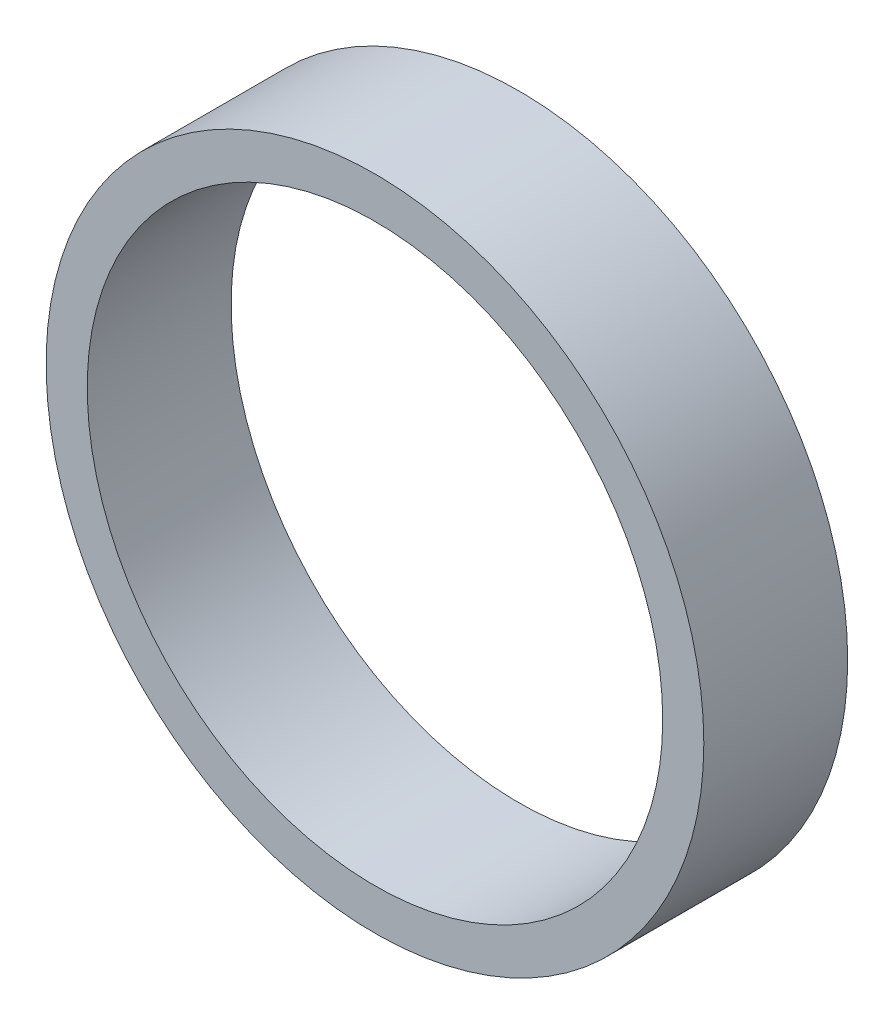
ISO-10303-21;
HEADER;
FILE_DESCRIPTION(('STEP AP214'),'2;1');
FILE_NAME('part.step','',(''),(''),'','','');
FILE_SCHEMA(('AUTOMOTIVE_DESIGN { 1 0 10303 214 1 1 1 1 }'));
ENDSEC;
DATA;
#1=APPLICATION_CONTEXT('core data for automotive mechanical design processes');
#2=APPLICATION_PROTOCOL_DEFINITION('international standard','automotive_design',2000,#1);
#3=PRODUCT_CONTEXT('',#1,'mechanical');
#4=PRODUCT('Part','Part','',(#3));
#5=PRODUCT_RELATED_PRODUCT_CATEGORY('part','',(#4));
#6=PRODUCT_DEFINITION_FORMATION('','',#4);
#7=PRODUCT_DEFINITION_CONTEXT('part definition',#1,'design');
#8=PRODUCT_DEFINITION('design','',#6,#7);
#9=PRODUCT_DEFINITION_SHAPE('','',#8);
#10=(LENGTH_UNIT() NAMED_UNIT(*) SI_UNIT(.MILLI.,.METRE.));
#11=(NAMED_UNIT(*) PLANE_ANGLE_UNIT() SI_UNIT($,.RADIAN.));
#12=(NAMED_UNIT(*) SI_UNIT($,.STERADIAN.) SOLID_ANGLE_UNIT());
#13=UNCERTAINTY_MEASURE_WITH_UNIT(LENGTH_MEASURE(1.E-05),#10,'distance_accuracy_value','');
#14=(GEOMETRIC_REPRESENTATION_CONTEXT(3) GLOBAL_UNCERTAINTY_ASSIGNED_CONTEXT((#13)) GLOBAL_UNIT_ASSIGNED_CONTEXT((#10,
#11,#12)) REPRESENTATION_CONTEXT('',''));
#15=CARTESIAN_POINT('',(0.,0.,0.));
#16=DIRECTION('',(0.,0.,1.));
#17=DIRECTION('',(1.,0.,0.));
#18=AXIS2_PLACEMENT_3D('',#15,#16,#17);
#19=CARTESIAN_POINT('',(0.,0.,11.1125));
#20=DIRECTION('',(0.,0.,1.));
#21=DIRECTION('',(1.,0.,0.));
#22=AXIS2_PLACEMENT_3D('',#19,#20,#21);
#23=PLANE('',#22);
#24=CARTESIAN_POINT('',(0.,0.,11.1125));
#25=DIRECTION('',(0.,0.,1.));
#26=DIRECTION('',(1.,0.,0.));
#27=AXIS2_PLACEMENT_3D('',#24,#25,#26);
#28=CIRCLE('',#27,50.8);
#29=CARTESIAN_POINT('',(50.8,0.,11.1125));
#30=VERTEX_POINT('',#29);
#31=EDGE_CURVE('E10',#30,#30,#28,.T.);
#32=ORIENTED_EDGE('',*,*,#31,.T.);
#33=EDGE_LOOP('',(#32));
#34=FACE_BOUND('',#33,.T.);
#35=CARTESIAN_POINT('',(0.,0.,11.1125));
#36=DIRECTION('',(0.,0.,1.));
#37=DIRECTION('',(1.,0.,0.));
#38=AXIS2_PLACEMENT_3D('',#35,#36,#37);
#39=CIRCLE('',#38,44.45);
#40=CARTESIAN_POINT('',(44.45,0.,11.1125));
#41=VERTEX_POINT('',#40);
#42=EDGE_CURVE('E49',#41,#41,#39,.T.);
#43=ORIENTED_EDGE('',*,*,#42,.F.);
#44=EDGE_LOOP('',(#43));
#45=FACE_BOUND('',#44,.T.);
#46=ADVANCED_FACE('F38',(#34,#45),#23,.T.);
#47=CARTESIAN_POINT('',(0.,0.,-11.1125));
#48=DIRECTION('',(0.,0.,1.));
#49=DIRECTION('',(1.,0.,0.));
#50=AXIS2_PLACEMENT_3D('',#47,#48,#49);
#51=PLANE('',#50);
#52=CARTESIAN_POINT('',(0.,0.,-11.1125));
#53=DIRECTION('',(0.,0.,1.));
#54=DIRECTION('',(1.,0.,0.));
#55=AXIS2_PLACEMENT_3D('',#52,#53,#54);
#56=CIRCLE('',#55,50.8);
#57=CARTESIAN_POINT('',(50.8,0.,-11.1125));
#58=VERTEX_POINT('',#57);
#59=EDGE_CURVE('E42',#58,#58,#56,.T.);
#60=ORIENTED_EDGE('',*,*,#59,.F.);
#61=EDGE_LOOP('',(#60));
#62=FACE_BOUND('',#61,.T.);
#63=CARTESIAN_POINT('',(0.,0.,-11.1125));
#64=DIRECTION('',(0.,0.,1.));
#65=DIRECTION('',(1.,0.,0.));
#66=AXIS2_PLACEMENT_3D('',#63,#64,#65);
#67=CIRCLE('',#66,44.45);
#68=CARTESIAN_POINT('',(44.45,0.,-11.1125));
#69=VERTEX_POINT('',#68);
#70=EDGE_CURVE('E51',#69,#69,#67,.T.);
#71=ORIENTED_EDGE('',*,*,#70,.T.);
#72=EDGE_LOOP('',(#71));
#73=FACE_BOUND('',#72,.T.);
#74=ADVANCED_FACE('F61',(#62,#73),#51,.F.);
#75=CARTESIAN_POINT('',(0.,0.,11.1125));
#76=DIRECTION('',(0.,0.,-1.));
#77=DIRECTION('',(-1.,0.,0.));
#78=AXIS2_PLACEMENT_3D('',#75,#76,#77);
#79=CYLINDRICAL_SURFACE('',#78,50.8);
#80=ORIENTED_EDGE('',*,*,#31,.F.);
#81=EDGE_LOOP('',(#80));
#82=FACE_BOUND('',#81,.T.);
#83=ORIENTED_EDGE('',*,*,#59,.T.);
#84=EDGE_LOOP('',(#83));
#85=FACE_BOUND('',#84,.T.);
#86=ADVANCED_FACE('F40',(#82,#85),#79,.T.);
#87=CARTESIAN_POINT('',(0.,0.,11.1125));
#88=DIRECTION('',(0.,0.,-1.));
#89=DIRECTION('',(-1.,0.,0.));
#90=AXIS2_PLACEMENT_3D('',#87,#88,#89);
#91=CYLINDRICAL_SURFACE('',#90,44.45);
#92=ORIENTED_EDGE('',*,*,#42,.T.);
#93=EDGE_LOOP('',(#92));
#94=FACE_BOUND('',#93,.T.);
#95=ORIENTED_EDGE('',*,*,#70,.F.);
#96=EDGE_LOOP('',(#95));
#97=FACE_BOUND('',#96,.T.);
#98=ADVANCED_FACE('F57',(#94,#97),#91,.F.);
#99=CLOSED_SHELL('',(#46,#74,#86,#98));
#100=MANIFOLD_SOLID_BREP('B2',#99);
#101=ADVANCED_BREP_SHAPE_REPRESENTATION('',(#18,#100),#14);
#102=SHAPE_DEFINITION_REPRESENTATION(#9,#101);
ENDSEC;
END-ISO-10303-21;
